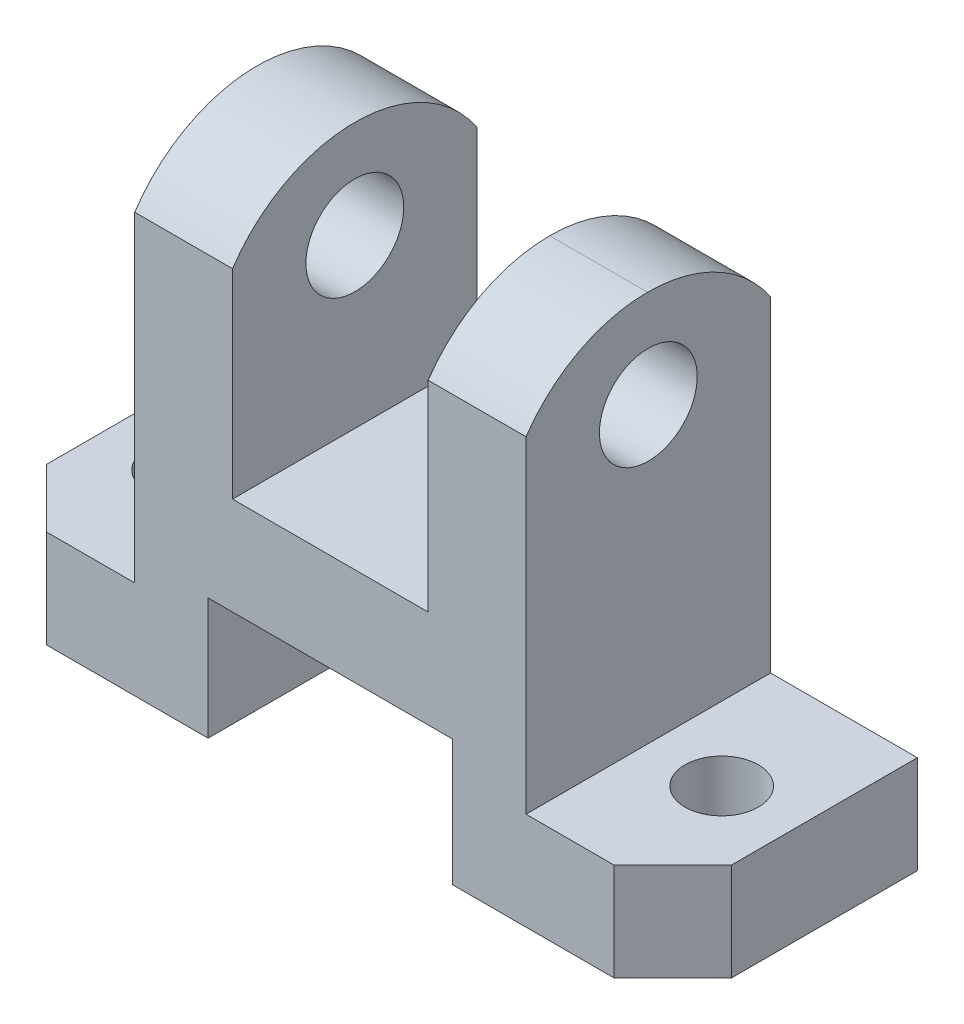
ISO-10303-21;
HEADER;
FILE_DESCRIPTION(('STEP AP214'),'2;1');
FILE_NAME('part.step','',(''),(''),'','','');
FILE_SCHEMA(('AUTOMOTIVE_DESIGN { 1 0 10303 214 1 1 1 1 }'));
ENDSEC;
DATA;
#1=APPLICATION_CONTEXT('core data for automotive mechanical design processes');
#2=APPLICATION_PROTOCOL_DEFINITION('international standard','automotive_design',2000,#1);
#3=PRODUCT_CONTEXT('',#1,'mechanical');
#4=PRODUCT('Part','Part','',(#3));
#5=PRODUCT_RELATED_PRODUCT_CATEGORY('part','',(#4));
#6=PRODUCT_DEFINITION_FORMATION('','',#4);
#7=PRODUCT_DEFINITION_CONTEXT('part definition',#1,'design');
#8=PRODUCT_DEFINITION('design','',#6,#7);
#9=PRODUCT_DEFINITION_SHAPE('','',#8);
#10=(LENGTH_UNIT() NAMED_UNIT(*) SI_UNIT(.MILLI.,.METRE.));
#11=(NAMED_UNIT(*) PLANE_ANGLE_UNIT() SI_UNIT($,.RADIAN.));
#12=(NAMED_UNIT(*) SI_UNIT($,.STERADIAN.) SOLID_ANGLE_UNIT());
#13=UNCERTAINTY_MEASURE_WITH_UNIT(LENGTH_MEASURE(1.E-05),#10,'distance_accuracy_value','');
#14=(GEOMETRIC_REPRESENTATION_CONTEXT(3) GLOBAL_UNCERTAINTY_ASSIGNED_CONTEXT((#13)) GLOBAL_UNIT_ASSIGNED_CONTEXT((#10,
#11,#12)) REPRESENTATION_CONTEXT('',''));
#15=CARTESIAN_POINT('',(0.,0.,0.));
#16=DIRECTION('',(0.,0.,1.));
#17=DIRECTION('',(1.,0.,0.));
#18=AXIS2_PLACEMENT_3D('',#15,#16,#17);
#19=CARTESIAN_POINT('',(-77.6358756958496,41.7128283446307,31.75));
#20=DIRECTION('',(1.,0.,0.));
#21=DIRECTION('',(0.,1.,0.));
#22=AXIS2_PLACEMENT_3D('',#19,#20,#21);
#23=PLANE('',#22);
#24=CARTESIAN_POINT('',(-77.6358756958496,28.4062611804516,15.875));
#25=DIRECTION('',(1.,0.,0.));
#26=DIRECTION('',(0.,1.,0.));
#27=AXIS2_PLACEMENT_3D('',#24,#25,#26);
#28=CIRCLE('',#27,6.35);
#29=CARTESIAN_POINT('',(-77.6358756958496,34.7562611804516,15.875));
#30=VERTEX_POINT('',#29);
#31=EDGE_CURVE('E343',#30,#30,#28,.T.);
#32=ORIENTED_EDGE('',*,*,#31,.T.);
#33=EDGE_LOOP('',(#32));
#34=FACE_BOUND('',#33,.T.);
#35=CARTESIAN_POINT('',(-77.6358756958496,22.0562611804516,15.875));
#36=DIRECTION('',(-1.,0.,0.));
#37=DIRECTION('',(0.,-1.,0.));
#38=AXIS2_PLACEMENT_3D('',#35,#36,#37);
#39=CIRCLE('',#38,19.05);
#40=CARTESIAN_POINT('',(-77.6358756958496,32.58654488983,31.75));
#41=VERTEX_POINT('',#40);
#42=CARTESIAN_POINT('',(-77.6358756958496,32.58654488983,0.));
#43=VERTEX_POINT('',#42);
#44=EDGE_CURVE('E169',#41,#43,#39,.T.);
#45=ORIENTED_EDGE('',*,*,#44,.T.);
#46=DIRECTION('',(0.,-1.,0.));
#47=VECTOR('',#46,1.);
#48=CARTESIAN_POINT('',(-77.6358756958496,41.7128283446307,0.));
#49=LINE('',#48,#47);
#50=CARTESIAN_POINT('',(-77.6358756958496,-9.08717165536931,0.));
#51=VERTEX_POINT('',#50);
#52=EDGE_CURVE('E173',#43,#51,#49,.T.);
#53=ORIENTED_EDGE('',*,*,#52,.T.);
#54=DIRECTION('',(0.,0.,-1.));
#55=VECTOR('',#54,1.);
#56=CARTESIAN_POINT('',(-77.6358756958496,-9.08717165536931,31.75));
#57=LINE('',#56,#55);
#58=CARTESIAN_POINT('',(-77.6358756958496,-9.08717165536931,31.75));
#59=VERTEX_POINT('',#58);
#60=EDGE_CURVE('E289',#59,#51,#57,.T.);
#61=ORIENTED_EDGE('',*,*,#60,.F.);
#62=DIRECTION('',(0.,-1.,0.));
#63=VECTOR('',#62,1.);
#64=CARTESIAN_POINT('',(-77.6358756958496,41.7128283446307,31.75));
#65=LINE('',#64,#63);
#66=EDGE_CURVE('E175',#41,#59,#65,.T.);
#67=ORIENTED_EDGE('',*,*,#66,.F.);
#68=EDGE_LOOP('',(#45,#53,#61,#67));
#69=FACE_BOUND('',#68,.T.);
#70=ADVANCED_FACE('F38',(#34,#69),#23,.F.);
#71=CARTESIAN_POINT('',(-64.9358756958496,41.7128283446307,31.75));
#72=DIRECTION('',(-1.,0.,0.));
#73=DIRECTION('',(0.,0.,1.));
#74=AXIS2_PLACEMENT_3D('',#71,#72,#73);
#75=PLANE('',#74);
#76=CARTESIAN_POINT('',(-64.9358756958496,28.4062611804516,15.875));
#77=DIRECTION('',(-1.,0.,0.));
#78=DIRECTION('',(0.,0.,1.));
#79=AXIS2_PLACEMENT_3D('',#76,#77,#78);
#80=CIRCLE('',#79,6.35);
#81=CARTESIAN_POINT('',(-64.9358756958496,28.4062611804516,22.225));
#82=VERTEX_POINT('',#81);
#83=EDGE_CURVE('E294',#82,#82,#80,.T.);
#84=ORIENTED_EDGE('',*,*,#83,.T.);
#85=EDGE_LOOP('',(#84));
#86=FACE_BOUND('',#85,.T.);
#87=DIRECTION('',(0.,1.,0.));
#88=VECTOR('',#87,1.);
#89=CARTESIAN_POINT('',(-64.9358756958496,41.7128283446307,0.));
#90=LINE('',#89,#88);
#91=CARTESIAN_POINT('',(-64.9358756958496,6.68357461328742,0.));
#92=VERTEX_POINT('',#91);
#93=CARTESIAN_POINT('',(-64.9358756958496,32.58654488983,0.));
#94=VERTEX_POINT('',#93);
#95=EDGE_CURVE('E246',#92,#94,#90,.T.);
#96=ORIENTED_EDGE('',*,*,#95,.T.);
#97=CARTESIAN_POINT('',(-64.9358756958496,22.0562611804516,15.875));
#98=DIRECTION('',(-1.,0.,0.));
#99=DIRECTION('',(0.,0.,1.));
#100=AXIS2_PLACEMENT_3D('',#97,#98,#99);
#101=CIRCLE('',#100,19.05);
#102=CARTESIAN_POINT('',(-64.9358756958496,32.58654488983,31.75));
#103=VERTEX_POINT('',#102);
#104=EDGE_CURVE('E185',#103,#94,#101,.T.);
#105=ORIENTED_EDGE('',*,*,#104,.F.);
#106=DIRECTION('',(0.,1.,0.));
#107=VECTOR('',#106,1.);
#108=CARTESIAN_POINT('',(-64.9358756958496,41.7128283446307,31.75));
#109=LINE('',#108,#107);
#110=CARTESIAN_POINT('',(-64.9358756958496,6.68357461328742,31.75));
#111=VERTEX_POINT('',#110);
#112=EDGE_CURVE('E207',#111,#103,#109,.T.);
#113=ORIENTED_EDGE('',*,*,#112,.F.);
#114=DIRECTION('',(0.,0.,-1.));
#115=VECTOR('',#114,1.);
#116=CARTESIAN_POINT('',(-64.9358756958496,6.68357461328742,31.75));
#117=LINE('',#116,#115);
#118=EDGE_CURVE('E249',#111,#92,#117,.T.);
#119=ORIENTED_EDGE('',*,*,#118,.T.);
#120=EDGE_LOOP('',(#96,#105,#113,#119));
#121=FACE_BOUND('',#120,.T.);
#122=ADVANCED_FACE('F406',(#86,#121),#75,.F.);
#123=CARTESIAN_POINT('',(0.,0.,0.));
#124=DIRECTION('',(0.,0.,-1.));
#125=DIRECTION('',(-1.,0.,0.));
#126=AXIS2_PLACEMENT_3D('',#123,#124,#125);
#127=PLANE('',#126);
#128=ORIENTED_EDGE('',*,*,#52,.F.);
#129=DIRECTION('',(-1.,0.,0.));
#130=VECTOR('',#129,1.);
#131=CARTESIAN_POINT('',(-52.2358756958496,32.58654488983,0.));
#132=LINE('',#131,#130);
#133=EDGE_CURVE('E180',#94,#43,#132,.T.);
#134=ORIENTED_EDGE('',*,*,#133,.F.);
#135=ORIENTED_EDGE('',*,*,#95,.F.);
#136=DIRECTION('',(-1.,0.,0.));
#137=VECTOR('',#136,1.);
#138=CARTESIAN_POINT('',(-64.9358756958496,6.68357461328742,0.));
#139=LINE('',#138,#137);
#140=CARTESIAN_POINT('',(-39.5358756958496,6.68357461328742,0.));
#141=VERTEX_POINT('',#140);
#142=EDGE_CURVE('E243',#141,#92,#139,.T.);
#143=ORIENTED_EDGE('',*,*,#142,.F.);
#144=DIRECTION('',(0.,-1.,0.));
#145=VECTOR('',#144,1.);
#146=CARTESIAN_POINT('',(-39.5358756958496,6.68357461328742,0.));
#147=LINE('',#146,#145);
#148=CARTESIAN_POINT('',(-39.5358756958496,32.58654488983,0.));
#149=VERTEX_POINT('',#148);
#150=EDGE_CURVE('E240',#149,#141,#147,.T.);
#151=ORIENTED_EDGE('',*,*,#150,.F.);
#152=DIRECTION('',(1.,0.,0.));
#153=VECTOR('',#152,1.);
#154=CARTESIAN_POINT('',(-52.2358756958496,32.58654488983,0.));
#155=LINE('',#154,#153);
#156=CARTESIAN_POINT('',(-26.8358756958496,32.58654488983,0.));
#157=VERTEX_POINT('',#156);
#158=EDGE_CURVE('E321',#149,#157,#155,.T.);
#159=ORIENTED_EDGE('',*,*,#158,.T.);
#160=DIRECTION('',(0.,1.,0.));
#161=VECTOR('',#160,1.);
#162=CARTESIAN_POINT('',(-26.8358756958496,41.1062611804516,0.));
#163=LINE('',#162,#161);
#164=CARTESIAN_POINT('',(-26.8358756958496,-9.6937388195484,0.));
#165=VERTEX_POINT('',#164);
#166=EDGE_CURVE('E236',#165,#157,#163,.T.);
#167=ORIENTED_EDGE('',*,*,#166,.F.);
#168=DIRECTION('',(-1.,0.,0.));
#169=VECTOR('',#168,1.);
#170=CARTESIAN_POINT('',(-26.8358756958496,-9.6937388195484,0.));
#171=LINE('',#170,#169);
#172=CARTESIAN_POINT('',(-7.78587569584956,-9.6937388195484,0.));
#173=VERTEX_POINT('',#172);
#174=EDGE_CURVE('E233',#173,#165,#171,.T.);
#175=ORIENTED_EDGE('',*,*,#174,.F.);
#176=DIRECTION('',(0.,1.,0.));
#177=VECTOR('',#176,1.);
#178=CARTESIAN_POINT('',(-7.78587569584956,-9.6937388195484,0.));
#179=LINE('',#178,#177);
#180=CARTESIAN_POINT('',(-7.78587569584956,-22.3937388195484,0.));
#181=VERTEX_POINT('',#180);
#182=EDGE_CURVE('E229',#181,#173,#179,.T.);
#183=ORIENTED_EDGE('',*,*,#182,.F.);
#184=DIRECTION('',(1.,0.,0.));
#185=VECTOR('',#184,1.);
#186=CARTESIAN_POINT('',(-7.78587569584956,-22.3937388195484,0.));
#187=LINE('',#186,#185);
#188=CARTESIAN_POINT('',(-36.3608756958496,-22.3937388195484,0.));
#189=VERTEX_POINT('',#188);
#190=EDGE_CURVE('E225',#189,#181,#187,.T.);
#191=ORIENTED_EDGE('',*,*,#190,.F.);
#192=DIRECTION('',(0.,-1.,0.));
#193=VECTOR('',#192,1.);
#194=CARTESIAN_POINT('',(-36.3608756958496,-22.3937388195484,0.));
#195=LINE('',#194,#193);
#196=CARTESIAN_POINT('',(-36.3608756958496,-6.01642538671258,0.));
#197=VERTEX_POINT('',#196);
#198=EDGE_CURVE('E222',#197,#189,#195,.T.);
#199=ORIENTED_EDGE('',*,*,#198,.F.);
#200=DIRECTION('',(1.,0.,0.));
#201=VECTOR('',#200,1.);
#202=CARTESIAN_POINT('',(-36.3608756958496,-6.01642538671258,0.));
#203=LINE('',#202,#201);
#204=CARTESIAN_POINT('',(-68.1108756958496,-6.01642538671258,0.));
#205=VERTEX_POINT('',#204);
#206=EDGE_CURVE('E219',#205,#197,#203,.T.);
#207=ORIENTED_EDGE('',*,*,#206,.F.);
#208=DIRECTION('',(0.,1.,0.));
#209=VECTOR('',#208,1.);
#210=CARTESIAN_POINT('',(-68.1108756958496,-6.01642538671258,0.));
#211=LINE('',#210,#209);
#212=CARTESIAN_POINT('',(-68.1108756958496,-21.7871716553693,0.));
#213=VERTEX_POINT('',#212);
#214=EDGE_CURVE('E216',#213,#205,#211,.T.);
#215=ORIENTED_EDGE('',*,*,#214,.F.);
#216=DIRECTION('',(1.,0.,0.));
#217=VECTOR('',#216,1.);
#218=CARTESIAN_POINT('',(-68.1108756958496,-21.7871716553693,0.));
#219=LINE('',#218,#217);
#220=CARTESIAN_POINT('',(-96.6858756958496,-21.7871716553693,0.));
#221=VERTEX_POINT('',#220);
#222=EDGE_CURVE('E213',#221,#213,#219,.T.);
#223=ORIENTED_EDGE('',*,*,#222,.F.);
#224=DIRECTION('',(0.,-1.,0.));
#225=VECTOR('',#224,1.);
#226=CARTESIAN_POINT('',(-96.6858756958496,-21.7871716553693,0.));
#227=LINE('',#226,#225);
#228=CARTESIAN_POINT('',(-96.6858756958496,-9.08717165536931,0.));
#229=VERTEX_POINT('',#228);
#230=EDGE_CURVE('E202',#229,#221,#227,.T.);
#231=ORIENTED_EDGE('',*,*,#230,.F.);
#232=DIRECTION('',(-1.,0.,0.));
#233=VECTOR('',#232,1.);
#234=CARTESIAN_POINT('',(-77.6358756958496,-9.08717165536931,0.));
#235=LINE('',#234,#233);
#236=EDGE_CURVE('E195',#51,#229,#235,.T.);
#237=ORIENTED_EDGE('',*,*,#236,.F.);
#238=EDGE_LOOP('',(#128,#134,#135,#143,#151,#159,#167,#175,#183,#191,#199,#207,#215,#223,#231,#237));
#239=FACE_BOUND('',#238,.T.);
#240=ADVANCED_FACE('F192',(#239),#127,.T.);
#241=CARTESIAN_POINT('',(0.,0.,31.75));
#242=DIRECTION('',(0.,0.,-1.));
#243=DIRECTION('',(-1.,0.,0.));
#244=AXIS2_PLACEMENT_3D('',#241,#242,#243);
#245=PLANE('',#244);
#246=DIRECTION('',(-1.,0.,0.));
#247=VECTOR('',#246,1.);
#248=CARTESIAN_POINT('',(-52.2358756958496,32.58654488983,31.75));
#249=LINE('',#248,#247);
#250=EDGE_CURVE('E179',#103,#41,#249,.T.);
#251=ORIENTED_EDGE('',*,*,#250,.T.);
#252=ORIENTED_EDGE('',*,*,#66,.T.);
#253=DIRECTION('',(-1.,0.,0.));
#254=VECTOR('',#253,1.);
#255=CARTESIAN_POINT('',(-77.6358756958496,-9.08717165536931,31.75));
#256=LINE('',#255,#254);
#257=CARTESIAN_POINT('',(-89.0658756958496,-9.08717165536932,31.75));
#258=VERTEX_POINT('',#257);
#259=EDGE_CURVE('E367',#59,#258,#256,.T.);
#260=ORIENTED_EDGE('',*,*,#259,.T.);
#261=DIRECTION('',(0.,1.,0.));
#262=VECTOR('',#261,1.);
#263=CARTESIAN_POINT('',(-89.0658756958496,0.,31.75));
#264=LINE('',#263,#262);
#265=CARTESIAN_POINT('',(-89.0658756958496,-21.7871716553693,31.75));
#266=VERTEX_POINT('',#265);
#267=EDGE_CURVE('E47',#266,#258,#264,.T.);
#268=ORIENTED_EDGE('',*,*,#267,.F.);
#269=DIRECTION('',(1.,0.,0.));
#270=VECTOR('',#269,1.);
#271=CARTESIAN_POINT('',(-68.1108756958496,-21.7871716553693,31.75));
#272=LINE('',#271,#270);
#273=CARTESIAN_POINT('',(-68.1108756958496,-21.7871716553693,31.75));
#274=VERTEX_POINT('',#273);
#275=EDGE_CURVE('E371',#266,#274,#272,.T.);
#276=ORIENTED_EDGE('',*,*,#275,.T.);
#277=DIRECTION('',(0.,1.,0.));
#278=VECTOR('',#277,1.);
#279=CARTESIAN_POINT('',(-68.1108756958496,-6.01642538671258,31.75));
#280=LINE('',#279,#278);
#281=CARTESIAN_POINT('',(-68.1108756958496,-6.01642538671258,31.75));
#282=VERTEX_POINT('',#281);
#283=EDGE_CURVE('E374',#274,#282,#280,.T.);
#284=ORIENTED_EDGE('',*,*,#283,.T.);
#285=DIRECTION('',(1.,0.,0.));
#286=VECTOR('',#285,1.);
#287=CARTESIAN_POINT('',(-36.3608756958496,-6.01642538671258,31.75));
#288=LINE('',#287,#286);
#289=CARTESIAN_POINT('',(-36.3608756958496,-6.01642538671258,31.75));
#290=VERTEX_POINT('',#289);
#291=EDGE_CURVE('E377',#282,#290,#288,.T.);
#292=ORIENTED_EDGE('',*,*,#291,.T.);
#293=DIRECTION('',(0.,-1.,0.));
#294=VECTOR('',#293,1.);
#295=CARTESIAN_POINT('',(-36.3608756958496,-22.3937388195484,31.75));
#296=LINE('',#295,#294);
#297=CARTESIAN_POINT('',(-36.3608756958496,-22.3937388195484,31.75));
#298=VERTEX_POINT('',#297);
#299=EDGE_CURVE('E380',#290,#298,#296,.T.);
#300=ORIENTED_EDGE('',*,*,#299,.T.);
#301=DIRECTION('',(1.,0.,0.));
#302=VECTOR('',#301,1.);
#303=CARTESIAN_POINT('',(-7.78587569584956,-22.3937388195484,31.75));
#304=LINE('',#303,#302);
#305=CARTESIAN_POINT('',(-15.4058756958496,-22.3937388195484,31.75));
#306=VERTEX_POINT('',#305);
#307=EDGE_CURVE('E383',#298,#306,#304,.T.);
#308=ORIENTED_EDGE('',*,*,#307,.T.);
#309=DIRECTION('',(0.,1.,0.));
#310=VECTOR('',#309,1.);
#311=CARTESIAN_POINT('',(-15.4058756958496,-22.3937388195484,31.75));
#312=LINE('',#311,#310);
#313=CARTESIAN_POINT('',(-15.4058756958496,-9.6937388195484,31.75));
#314=VERTEX_POINT('',#313);
#315=EDGE_CURVE('E352',#306,#314,#312,.T.);
#316=ORIENTED_EDGE('',*,*,#315,.T.);
#317=DIRECTION('',(-1.,0.,0.));
#318=VECTOR('',#317,1.);
#319=CARTESIAN_POINT('',(-26.8358756958496,-9.6937388195484,31.75));
#320=LINE('',#319,#318);
#321=CARTESIAN_POINT('',(-26.8358756958496,-9.6937388195484,31.75));
#322=VERTEX_POINT('',#321);
#323=EDGE_CURVE('E387',#314,#322,#320,.T.);
#324=ORIENTED_EDGE('',*,*,#323,.T.);
#325=DIRECTION('',(0.,1.,0.));
#326=VECTOR('',#325,1.);
#327=CARTESIAN_POINT('',(-26.8358756958496,41.1062611804516,31.75));
#328=LINE('',#327,#326);
#329=CARTESIAN_POINT('',(-26.8358756958496,32.7439433830127,31.75));
#330=VERTEX_POINT('',#329);
#331=EDGE_CURVE('E390',#322,#330,#328,.T.);
#332=ORIENTED_EDGE('',*,*,#331,.T.);
#333=DIRECTION('',(1.,0.,0.));
#334=VECTOR('',#333,1.);
#335=CARTESIAN_POINT('',(-58.5858756958496,32.7439433830127,31.75));
#336=LINE('',#335,#334);
#337=CARTESIAN_POINT('',(-39.5358756958496,32.7439433830127,31.75));
#338=VERTEX_POINT('',#337);
#339=EDGE_CURVE('E332',#338,#330,#336,.T.);
#340=ORIENTED_EDGE('',*,*,#339,.F.);
#341=DIRECTION('',(0.,-1.,0.));
#342=VECTOR('',#341,1.);
#343=CARTESIAN_POINT('',(-39.5358756958496,6.68357461328742,31.75));
#344=LINE('',#343,#342);
#345=CARTESIAN_POINT('',(-39.5358756958496,6.68357461328742,31.75));
#346=VERTEX_POINT('',#345);
#347=EDGE_CURVE('E394',#338,#346,#344,.T.);
#348=ORIENTED_EDGE('',*,*,#347,.T.);
#349=DIRECTION('',(-1.,0.,0.));
#350=VECTOR('',#349,1.);
#351=CARTESIAN_POINT('',(-64.9358756958496,6.68357461328742,31.75));
#352=LINE('',#351,#350);
#353=EDGE_CURVE('E396',#346,#111,#352,.T.);
#354=ORIENTED_EDGE('',*,*,#353,.T.);
#355=ORIENTED_EDGE('',*,*,#112,.T.);
#356=EDGE_LOOP('',(#251,#252,#260,#268,#276,#284,#292,#300,#308,#316,#324,#332,#340,#348,#354,#355));
#357=FACE_BOUND('',#356,.T.);
#358=ADVANCED_FACE('F404',(#357),#245,.F.);
#359=CARTESIAN_POINT('',(-26.8358756958496,41.1062611804516,31.75));
#360=DIRECTION('',(-1.,0.,0.));
#361=DIRECTION('',(0.,-1.,0.));
#362=AXIS2_PLACEMENT_3D('',#359,#360,#361);
#363=PLANE('',#362);
#364=CARTESIAN_POINT('',(-26.8358756958496,28.4062611804516,15.875));
#365=DIRECTION('',(1.,0.,0.));
#366=DIRECTION('',(0.,1.,0.));
#367=AXIS2_PLACEMENT_3D('',#364,#365,#366);
#368=CIRCLE('',#367,6.35);
#369=CARTESIAN_POINT('',(-26.8358756958496,34.7562611804516,15.875));
#370=VERTEX_POINT('',#369);
#371=EDGE_CURVE('E298',#370,#370,#368,.T.);
#372=ORIENTED_EDGE('',*,*,#371,.F.);
#373=EDGE_LOOP('',(#372));
#374=FACE_BOUND('',#373,.T.);
#375=ORIENTED_EDGE('',*,*,#166,.T.);
#376=CARTESIAN_POINT('',(-26.8358756958496,21.8589569478528,15.9805374493276));
#377=DIRECTION('',(-1.,0.,0.));
#378=DIRECTION('',(0.,-1.,0.));
#379=AXIS2_PLACEMENT_3D('',#376,#377,#378);
#380=CIRCLE('',#379,19.2473042325988);
#381=CARTESIAN_POINT('',(-26.8358756958496,41.1062611804516,15.9805374493276));
#382=VERTEX_POINT('',#381);
#383=EDGE_CURVE('E318',#382,#157,#380,.T.);
#384=ORIENTED_EDGE('',*,*,#383,.F.);
#385=CARTESIAN_POINT('',(-26.8358756958496,22.0562611804516,15.9805374493276));
#386=DIRECTION('',(1.,0.,0.));
#387=DIRECTION('',(0.,1.,0.));
#388=AXIS2_PLACEMENT_3D('',#385,#386,#387);
#389=CIRCLE('',#388,19.05);
#390=EDGE_CURVE('E327',#382,#330,#389,.T.);
#391=ORIENTED_EDGE('',*,*,#390,.T.);
#392=ORIENTED_EDGE('',*,*,#331,.F.);
#393=DIRECTION('',(0.,0.,-1.));
#394=VECTOR('',#393,1.);
#395=CARTESIAN_POINT('',(-26.8358756958496,-9.6937388195484,31.75));
#396=LINE('',#395,#394);
#397=EDGE_CURVE('E257',#322,#165,#396,.T.);
#398=ORIENTED_EDGE('',*,*,#397,.T.);
#399=EDGE_LOOP('',(#375,#384,#391,#392,#398));
#400=FACE_BOUND('',#399,.T.);
#401=ADVANCED_FACE('F424',(#374,#400),#363,.F.);
#402=CARTESIAN_POINT('',(-39.5358756958496,6.68357461328742,31.75));
#403=DIRECTION('',(1.,0.,0.));
#404=DIRECTION('',(0.,0.,-1.));
#405=AXIS2_PLACEMENT_3D('',#402,#403,#404);
#406=PLANE('',#405);
#407=CARTESIAN_POINT('',(-39.5358756958496,28.4062611804516,15.875));
#408=DIRECTION('',(1.,0.,0.));
#409=DIRECTION('',(0.,0.,-1.));
#410=AXIS2_PLACEMENT_3D('',#407,#408,#409);
#411=CIRCLE('',#410,6.35);
#412=CARTESIAN_POINT('',(-39.5358756958496,28.4062611804516,9.525));
#413=VERTEX_POINT('',#412);
#414=EDGE_CURVE('E297',#413,#413,#411,.T.);
#415=ORIENTED_EDGE('',*,*,#414,.T.);
#416=EDGE_LOOP('',(#415));
#417=FACE_BOUND('',#416,.T.);
#418=CARTESIAN_POINT('',(-39.5358756958496,22.0562611804516,15.9805374493276));
#419=DIRECTION('',(1.,0.,0.));
#420=DIRECTION('',(0.,0.,-1.));
#421=AXIS2_PLACEMENT_3D('',#418,#419,#420);
#422=CIRCLE('',#421,19.05);
#423=CARTESIAN_POINT('',(-39.5358756958496,41.1062611804516,15.9805374493276));
#424=VERTEX_POINT('',#423);
#425=EDGE_CURVE('E11',#424,#338,#422,.T.);
#426=ORIENTED_EDGE('',*,*,#425,.F.);
#427=CARTESIAN_POINT('',(-39.5358756958496,21.8589569478528,15.9805374493276));
#428=DIRECTION('',(1.,0.,0.));
#429=DIRECTION('',(0.,0.,-1.));
#430=AXIS2_PLACEMENT_3D('',#427,#428,#429);
#431=CIRCLE('',#430,19.2473042325988);
#432=EDGE_CURVE('E55',#424,#149,#431,.F.);
#433=ORIENTED_EDGE('',*,*,#432,.T.);
#434=ORIENTED_EDGE('',*,*,#150,.T.);
#435=DIRECTION('',(0.,0.,-1.));
#436=VECTOR('',#435,1.);
#437=CARTESIAN_POINT('',(-39.5358756958496,6.68357461328742,31.75));
#438=LINE('',#437,#436);
#439=EDGE_CURVE('E253',#346,#141,#438,.T.);
#440=ORIENTED_EDGE('',*,*,#439,.F.);
#441=ORIENTED_EDGE('',*,*,#347,.F.);
#442=EDGE_LOOP('',(#426,#433,#434,#440,#441));
#443=FACE_BOUND('',#442,.T.);
#444=ADVANCED_FACE('F415',(#417,#443),#406,.F.);
#445=CARTESIAN_POINT('',(-77.6358756958496,-9.08717165536931,31.75));
#446=DIRECTION('',(0.,-1.,0.));
#447=DIRECTION('',(1.,0.,0.));
#448=AXIS2_PLACEMENT_3D('',#445,#446,#447);
#449=PLANE('',#448);
#450=CARTESIAN_POINT('',(-87.1608756958496,-9.08717165536931,15.875));
#451=DIRECTION('',(0.,1.,0.));
#452=DIRECTION('',(-1.,0.,0.));
#453=AXIS2_PLACEMENT_3D('',#450,#451,#452);
#454=CIRCLE('',#453,4.7625);
#455=CARTESIAN_POINT('',(-91.9233756958496,-9.08717165536931,15.875));
#456=VERTEX_POINT('',#455);
#457=EDGE_CURVE('E311',#456,#456,#454,.T.);
#458=ORIENTED_EDGE('',*,*,#457,.F.);
#459=EDGE_LOOP('',(#458));
#460=FACE_BOUND('',#459,.T.);
#461=DIRECTION('',(-0.707106781186548,0.,-0.707106781186547));
#462=VECTOR('',#461,1.);
#463=CARTESIAN_POINT('',(-83.3508756958496,-9.08717165536931,37.465));
#464=LINE('',#463,#462);
#465=CARTESIAN_POINT('',(-96.6858756958496,-9.08717165536932,24.13));
#466=VERTEX_POINT('',#465);
#467=EDGE_CURVE('E198',#258,#466,#464,.T.);
#468=ORIENTED_EDGE('',*,*,#467,.F.);
#469=ORIENTED_EDGE('',*,*,#259,.F.);
#470=ORIENTED_EDGE('',*,*,#60,.T.);
#471=ORIENTED_EDGE('',*,*,#236,.T.);
#472=DIRECTION('',(0.,0.,-1.));
#473=VECTOR('',#472,1.);
#474=CARTESIAN_POINT('',(-96.6858756958496,-9.08717165536931,31.75));
#475=LINE('',#474,#473);
#476=EDGE_CURVE('E286',#466,#229,#475,.T.);
#477=ORIENTED_EDGE('',*,*,#476,.F.);
#478=EDGE_LOOP('',(#468,#469,#470,#471,#477));
#479=FACE_BOUND('',#478,.T.);
#480=ADVANCED_FACE('F468',(#460,#479),#449,.F.);
#481=CARTESIAN_POINT('',(-96.6858756958496,-21.7871716553693,31.75));
#482=DIRECTION('',(1.,0.,0.));
#483=DIRECTION('',(0.,0.,-1.));
#484=AXIS2_PLACEMENT_3D('',#481,#482,#483);
#485=PLANE('',#484);
#486=DIRECTION('',(0.,1.,0.));
#487=VECTOR('',#486,1.);
#488=CARTESIAN_POINT('',(-96.6858756958496,-22.3937388195484,24.13));
#489=LINE('',#488,#487);
#490=CARTESIAN_POINT('',(-96.6858756958496,-21.7871716553693,24.13));
#491=VERTEX_POINT('',#490);
#492=EDGE_CURVE('E348',#491,#466,#489,.T.);
#493=ORIENTED_EDGE('',*,*,#492,.T.);
#494=ORIENTED_EDGE('',*,*,#476,.T.);
#495=ORIENTED_EDGE('',*,*,#230,.T.);
#496=DIRECTION('',(0.,0.,-1.));
#497=VECTOR('',#496,1.);
#498=CARTESIAN_POINT('',(-96.6858756958496,-21.7871716553693,31.75));
#499=LINE('',#498,#497);
#500=EDGE_CURVE('E283',#491,#221,#499,.T.);
#501=ORIENTED_EDGE('',*,*,#500,.F.);
#502=EDGE_LOOP('',(#493,#494,#495,#501));
#503=FACE_BOUND('',#502,.T.);
#504=ADVANCED_FACE('F464',(#503),#485,.F.);
#505=CARTESIAN_POINT('',(-68.1108756958496,-21.7871716553693,31.75));
#506=DIRECTION('',(0.,1.,0.));
#507=DIRECTION('',(0.,0.,1.));
#508=AXIS2_PLACEMENT_3D('',#505,#506,#507);
#509=PLANE('',#508);
#510=CARTESIAN_POINT('',(-87.1608756958496,-21.7871716553693,15.875));
#511=DIRECTION('',(0.,1.,0.));
#512=DIRECTION('',(0.,0.,1.));
#513=AXIS2_PLACEMENT_3D('',#510,#511,#512);
#514=CIRCLE('',#513,4.7625);
#515=CARTESIAN_POINT('',(-87.1608756958496,-21.7871716553693,20.6375));
#516=VERTEX_POINT('',#515);
#517=EDGE_CURVE('E41',#516,#516,#514,.T.);
#518=ORIENTED_EDGE('',*,*,#517,.T.);
#519=EDGE_LOOP('',(#518));
#520=FACE_BOUND('',#519,.T.);
#521=DIRECTION('',(0.707106781186548,0.,0.707106781186547));
#522=VECTOR('',#521,1.);
#523=CARTESIAN_POINT('',(-78.5883756958496,-21.7871716553693,42.2275));
#524=LINE('',#523,#522);
#525=EDGE_CURVE('E204',#491,#266,#524,.T.);
#526=ORIENTED_EDGE('',*,*,#525,.F.);
#527=ORIENTED_EDGE('',*,*,#500,.T.);
#528=ORIENTED_EDGE('',*,*,#222,.T.);
#529=DIRECTION('',(0.,0.,-1.));
#530=VECTOR('',#529,1.);
#531=CARTESIAN_POINT('',(-68.1108756958496,-21.7871716553693,31.75));
#532=LINE('',#531,#530);
#533=EDGE_CURVE('E279',#274,#213,#532,.T.);
#534=ORIENTED_EDGE('',*,*,#533,.F.);
#535=ORIENTED_EDGE('',*,*,#275,.F.);
#536=EDGE_LOOP('',(#526,#527,#528,#534,#535));
#537=FACE_BOUND('',#536,.T.);
#538=ADVANCED_FACE('F460',(#520,#537),#509,.F.);
#539=CARTESIAN_POINT('',(-68.1108756958496,-6.01642538671258,31.75));
#540=DIRECTION('',(-1.,0.,0.));
#541=DIRECTION('',(0.,0.,1.));
#542=AXIS2_PLACEMENT_3D('',#539,#540,#541);
#543=PLANE('',#542);
#544=ORIENTED_EDGE('',*,*,#214,.T.);
#545=DIRECTION('',(0.,0.,-1.));
#546=VECTOR('',#545,1.);
#547=CARTESIAN_POINT('',(-68.1108756958496,-6.01642538671258,31.75));
#548=LINE('',#547,#546);
#549=EDGE_CURVE('E275',#282,#205,#548,.T.);
#550=ORIENTED_EDGE('',*,*,#549,.F.);
#551=ORIENTED_EDGE('',*,*,#283,.F.);
#552=ORIENTED_EDGE('',*,*,#533,.T.);
#553=EDGE_LOOP('',(#544,#550,#551,#552));
#554=FACE_BOUND('',#553,.T.);
#555=ADVANCED_FACE('F455',(#554),#543,.F.);
#556=CARTESIAN_POINT('',(-36.3608756958496,-6.01642538671258,31.75));
#557=DIRECTION('',(0.,1.,0.));
#558=DIRECTION('',(-1.,0.,0.));
#559=AXIS2_PLACEMENT_3D('',#556,#557,#558);
#560=PLANE('',#559);
#561=ORIENTED_EDGE('',*,*,#206,.T.);
#562=DIRECTION('',(0.,0.,-1.));
#563=VECTOR('',#562,1.);
#564=CARTESIAN_POINT('',(-36.3608756958496,-6.01642538671258,31.75));
#565=LINE('',#564,#563);
#566=EDGE_CURVE('E271',#290,#197,#565,.T.);
#567=ORIENTED_EDGE('',*,*,#566,.F.);
#568=ORIENTED_EDGE('',*,*,#291,.F.);
#569=ORIENTED_EDGE('',*,*,#549,.T.);
#570=EDGE_LOOP('',(#561,#567,#568,#569));
#571=FACE_BOUND('',#570,.T.);
#572=ADVANCED_FACE('F451',(#571),#560,.F.);
#573=CARTESIAN_POINT('',(-36.3608756958496,-22.3937388195484,31.75));
#574=DIRECTION('',(1.,0.,0.));
#575=DIRECTION('',(0.,0.,-1.));
#576=AXIS2_PLACEMENT_3D('',#573,#574,#575);
#577=PLANE('',#576);
#578=ORIENTED_EDGE('',*,*,#198,.T.);
#579=DIRECTION('',(0.,0.,-1.));
#580=VECTOR('',#579,1.);
#581=CARTESIAN_POINT('',(-36.3608756958496,-22.3937388195484,31.75));
#582=LINE('',#581,#580);
#583=EDGE_CURVE('E267',#298,#189,#582,.T.);
#584=ORIENTED_EDGE('',*,*,#583,.F.);
#585=ORIENTED_EDGE('',*,*,#299,.F.);
#586=ORIENTED_EDGE('',*,*,#566,.T.);
#587=EDGE_LOOP('',(#578,#584,#585,#586));
#588=FACE_BOUND('',#587,.T.);
#589=ADVANCED_FACE('F446',(#588),#577,.F.);
#590=CARTESIAN_POINT('',(-7.78587569584956,-22.3937388195484,31.75));
#591=DIRECTION('',(0.,1.,0.));
#592=DIRECTION('',(-1.,0.,0.));
#593=AXIS2_PLACEMENT_3D('',#590,#591,#592);
#594=PLANE('',#593);
#595=CARTESIAN_POINT('',(-17.3108756958496,-22.3937388195484,15.875));
#596=DIRECTION('',(0.,1.,0.));
#597=DIRECTION('',(-1.,0.,0.));
#598=AXIS2_PLACEMENT_3D('',#595,#596,#597);
#599=CIRCLE('',#598,4.7625);
#600=CARTESIAN_POINT('',(-22.0733756958496,-22.3937388195484,15.875));
#601=VERTEX_POINT('',#600);
#602=EDGE_CURVE('E301',#601,#601,#599,.T.);
#603=ORIENTED_EDGE('',*,*,#602,.T.);
#604=EDGE_LOOP('',(#603));
#605=FACE_BOUND('',#604,.T.);
#606=DIRECTION('',(0.,0.,-1.));
#607=VECTOR('',#606,1.);
#608=CARTESIAN_POINT('',(-7.78587569584956,-22.3937388195484,31.75));
#609=LINE('',#608,#607);
#610=CARTESIAN_POINT('',(-7.78587569584956,-22.3937388195484,24.13));
#611=VERTEX_POINT('',#610);
#612=EDGE_CURVE('E264',#611,#181,#609,.T.);
#613=ORIENTED_EDGE('',*,*,#612,.F.);
#614=DIRECTION('',(-0.707106781186548,0.,0.707106781186547));
#615=VECTOR('',#614,1.);
#616=CARTESIAN_POINT('',(8.17206215207522,-22.3937388195484,8.17206215207522));
#617=LINE('',#616,#615);
#618=EDGE_CURVE('E347',#611,#306,#617,.T.);
#619=ORIENTED_EDGE('',*,*,#618,.T.);
#620=ORIENTED_EDGE('',*,*,#307,.F.);
#621=ORIENTED_EDGE('',*,*,#583,.T.);
#622=ORIENTED_EDGE('',*,*,#190,.T.);
#623=EDGE_LOOP('',(#613,#619,#620,#621,#622));
#624=FACE_BOUND('',#623,.T.);
#625=ADVANCED_FACE('F439',(#605,#624),#594,.F.);
#626=CARTESIAN_POINT('',(-7.78587569584956,-9.6937388195484,31.75));
#627=DIRECTION('',(-1.,0.,0.));
#628=DIRECTION('',(0.,-1.,0.));
#629=AXIS2_PLACEMENT_3D('',#626,#627,#628);
#630=PLANE('',#629);
#631=DIRECTION('',(0.,0.,-1.));
#632=VECTOR('',#631,1.);
#633=CARTESIAN_POINT('',(-7.78587569584956,-9.6937388195484,31.75));
#634=LINE('',#633,#632);
#635=CARTESIAN_POINT('',(-7.78587569584956,-9.69373881954841,24.13));
#636=VERTEX_POINT('',#635);
#637=EDGE_CURVE('E261',#636,#173,#634,.T.);
#638=ORIENTED_EDGE('',*,*,#637,.F.);
#639=DIRECTION('',(0.,1.,0.));
#640=VECTOR('',#639,1.);
#641=CARTESIAN_POINT('',(-7.78587569584956,-22.3937388195484,24.13));
#642=LINE('',#641,#640);
#643=EDGE_CURVE('E356',#611,#636,#642,.T.);
#644=ORIENTED_EDGE('',*,*,#643,.F.);
#645=ORIENTED_EDGE('',*,*,#612,.T.);
#646=ORIENTED_EDGE('',*,*,#182,.T.);
#647=EDGE_LOOP('',(#638,#644,#645,#646));
#648=FACE_BOUND('',#647,.T.);
#649=ADVANCED_FACE('F436',(#648),#630,.F.);
#650=CARTESIAN_POINT('',(-26.8358756958496,-9.6937388195484,31.75));
#651=DIRECTION('',(0.,-1.,0.));
#652=DIRECTION('',(1.,0.,0.));
#653=AXIS2_PLACEMENT_3D('',#650,#651,#652);
#654=PLANE('',#653);
#655=CARTESIAN_POINT('',(-17.3108756958496,-9.6937388195484,15.875));
#656=DIRECTION('',(0.,-1.,0.));
#657=DIRECTION('',(1.,0.,0.));
#658=AXIS2_PLACEMENT_3D('',#655,#656,#657);
#659=CIRCLE('',#658,4.7625);
#660=CARTESIAN_POINT('',(-12.5483756958496,-9.6937388195484,15.875));
#661=VERTEX_POINT('',#660);
#662=EDGE_CURVE('E190',#661,#661,#659,.T.);
#663=ORIENTED_EDGE('',*,*,#662,.T.);
#664=EDGE_LOOP('',(#663));
#665=FACE_BOUND('',#664,.T.);
#666=ORIENTED_EDGE('',*,*,#323,.F.);
#667=DIRECTION('',(0.707106781186548,0.,-0.707106781186547));
#668=VECTOR('',#667,1.);
#669=CARTESIAN_POINT('',(-21.1208756958496,-9.6937388195484,37.465));
#670=LINE('',#669,#668);
#671=EDGE_CURVE('E63',#314,#636,#670,.T.);
#672=ORIENTED_EDGE('',*,*,#671,.T.);
#673=ORIENTED_EDGE('',*,*,#637,.T.);
#674=ORIENTED_EDGE('',*,*,#174,.T.);
#675=ORIENTED_EDGE('',*,*,#397,.F.);
#676=EDGE_LOOP('',(#666,#672,#673,#674,#675));
#677=FACE_BOUND('',#676,.T.);
#678=ADVANCED_FACE('F432',(#665,#677),#654,.F.);
#679=CARTESIAN_POINT('',(-64.9358756958496,6.68357461328742,31.75));
#680=DIRECTION('',(0.,-1.,0.));
#681=DIRECTION('',(1.,0.,0.));
#682=AXIS2_PLACEMENT_3D('',#679,#680,#681);
#683=PLANE('',#682);
#684=ORIENTED_EDGE('',*,*,#142,.T.);
#685=ORIENTED_EDGE('',*,*,#118,.F.);
#686=ORIENTED_EDGE('',*,*,#353,.F.);
#687=ORIENTED_EDGE('',*,*,#439,.T.);
#688=EDGE_LOOP('',(#684,#685,#686,#687));
#689=FACE_BOUND('',#688,.T.);
#690=ADVANCED_FACE('F410',(#689),#683,.F.);
#691=CARTESIAN_POINT('',(8.17206215207522,-22.3937388195484,8.17206215207522));
#692=DIRECTION('',(-0.707106781186547,0.,-0.707106781186548));
#693=DIRECTION('',(-0.707106781186548,0.,0.707106781186547));
#694=AXIS2_PLACEMENT_3D('',#691,#692,#693);
#695=PLANE('',#694);
#696=ORIENTED_EDGE('',*,*,#315,.F.);
#697=ORIENTED_EDGE('',*,*,#618,.F.);
#698=ORIENTED_EDGE('',*,*,#643,.T.);
#699=ORIENTED_EDGE('',*,*,#671,.F.);
#700=EDGE_LOOP('',(#696,#697,#698,#699));
#701=FACE_BOUND('',#700,.T.);
#702=ADVANCED_FACE('F475',(#701),#695,.F.);
#703=CARTESIAN_POINT('',(-60.4079378479248,-22.3937388195484,60.4079378479248));
#704=DIRECTION('',(-0.707106781186547,0.,0.707106781186548));
#705=DIRECTION('',(0.707106781186548,0.,0.707106781186547));
#706=AXIS2_PLACEMENT_3D('',#703,#704,#705);
#707=PLANE('',#706);
#708=ORIENTED_EDGE('',*,*,#467,.T.);
#709=ORIENTED_EDGE('',*,*,#492,.F.);
#710=ORIENTED_EDGE('',*,*,#525,.T.);
#711=ORIENTED_EDGE('',*,*,#267,.T.);
#712=EDGE_LOOP('',(#708,#709,#710,#711));
#713=FACE_BOUND('',#712,.T.);
#714=ADVANCED_FACE('F472',(#713),#707,.T.);
#715=CARTESIAN_POINT('',(-96.6858756958496,28.4062611804516,15.875));
#716=DIRECTION('',(1.,0.,0.));
#717=DIRECTION('',(0.,1.,0.));
#718=AXIS2_PLACEMENT_3D('',#715,#716,#717);
#719=CYLINDRICAL_SURFACE('',#718,6.35);
#720=ORIENTED_EDGE('',*,*,#83,.F.);
#721=EDGE_LOOP('',(#720));
#722=FACE_BOUND('',#721,.T.);
#723=ORIENTED_EDGE('',*,*,#31,.F.);
#724=EDGE_LOOP('',(#723));
#725=FACE_BOUND('',#724,.T.);
#726=ADVANCED_FACE('F474',(#722,#725),#719,.F.);
#727=ORIENTED_EDGE('',*,*,#371,.T.);
#728=EDGE_LOOP('',(#727));
#729=FACE_BOUND('',#728,.T.);
#730=ORIENTED_EDGE('',*,*,#414,.F.);
#731=EDGE_LOOP('',(#730));
#732=FACE_BOUND('',#731,.T.);
#733=ADVANCED_FACE('F481',(#729,#732),#719,.F.);
#734=CARTESIAN_POINT('',(-58.5858756958496,22.0562611804516,15.9805374493276));
#735=DIRECTION('',(1.,0.,0.));
#736=DIRECTION('',(0.,1.,0.));
#737=AXIS2_PLACEMENT_3D('',#734,#735,#736);
#738=CYLINDRICAL_SURFACE('',#737,19.05);
#739=ORIENTED_EDGE('',*,*,#425,.T.);
#740=ORIENTED_EDGE('',*,*,#339,.T.);
#741=ORIENTED_EDGE('',*,*,#390,.F.);
#742=DIRECTION('',(1.,0.,0.));
#743=VECTOR('',#742,1.);
#744=CARTESIAN_POINT('',(-58.5858756958496,41.1062611804516,15.9805374493276));
#745=LINE('',#744,#743);
#746=EDGE_CURVE('E331',#424,#382,#745,.T.);
#747=ORIENTED_EDGE('',*,*,#746,.F.);
#748=EDGE_LOOP('',(#739,#740,#741,#747));
#749=FACE_BOUND('',#748,.T.);
#750=ADVANCED_FACE('F418',(#749),#738,.T.);
#751=CARTESIAN_POINT('',(-52.2358756958496,21.8589569478528,15.9805374493276));
#752=DIRECTION('',(1.,0.,0.));
#753=DIRECTION('',(0.,1.,0.));
#754=AXIS2_PLACEMENT_3D('',#751,#752,#753);
#755=CYLINDRICAL_SURFACE('',#754,19.2473042325988);
#756=ORIENTED_EDGE('',*,*,#746,.T.);
#757=ORIENTED_EDGE('',*,*,#383,.T.);
#758=ORIENTED_EDGE('',*,*,#158,.F.);
#759=ORIENTED_EDGE('',*,*,#432,.F.);
#760=EDGE_LOOP('',(#756,#757,#758,#759));
#761=FACE_BOUND('',#760,.T.);
#762=ADVANCED_FACE('F427',(#761),#755,.T.);
#763=CARTESIAN_POINT('',(-52.2358756958496,22.0562611804516,15.875));
#764=DIRECTION('',(-1.,0.,0.));
#765=DIRECTION('',(0.,-1.,0.));
#766=AXIS2_PLACEMENT_3D('',#763,#764,#765);
#767=CYLINDRICAL_SURFACE('',#766,19.05);
#768=ORIENTED_EDGE('',*,*,#104,.T.);
#769=ORIENTED_EDGE('',*,*,#133,.T.);
#770=ORIENTED_EDGE('',*,*,#44,.F.);
#771=ORIENTED_EDGE('',*,*,#250,.F.);
#772=EDGE_LOOP('',(#768,#769,#770,#771));
#773=FACE_BOUND('',#772,.T.);
#774=ADVANCED_FACE('F183',(#773),#767,.T.);
#775=CARTESIAN_POINT('',(-17.3108756958496,-22.3937388195484,15.875));
#776=DIRECTION('',(0.,1.,0.));
#777=DIRECTION('',(-1.,0.,0.));
#778=AXIS2_PLACEMENT_3D('',#775,#776,#777);
#779=CYLINDRICAL_SURFACE('',#778,4.7625);
#780=ORIENTED_EDGE('',*,*,#602,.F.);
#781=EDGE_LOOP('',(#780));
#782=FACE_BOUND('',#781,.T.);
#783=ORIENTED_EDGE('',*,*,#662,.F.);
#784=EDGE_LOOP('',(#783));
#785=FACE_BOUND('',#784,.T.);
#786=ADVANCED_FACE('F537',(#782,#785),#779,.F.);
#787=CARTESIAN_POINT('',(-87.1608756958496,-22.3937388195484,15.875));
#788=DIRECTION('',(0.,1.,0.));
#789=DIRECTION('',(-1.,0.,0.));
#790=AXIS2_PLACEMENT_3D('',#787,#788,#789);
#791=CYLINDRICAL_SURFACE('',#790,4.7625);
#792=ORIENTED_EDGE('',*,*,#457,.T.);
#793=EDGE_LOOP('',(#792));
#794=FACE_BOUND('',#793,.T.);
#795=ORIENTED_EDGE('',*,*,#517,.F.);
#796=EDGE_LOOP('',(#795));
#797=FACE_BOUND('',#796,.T.);
#798=ADVANCED_FACE('F534',(#794,#797),#791,.F.);
#799=CLOSED_SHELL('',(#70,#122,#240,#358,#401,#444,#480,#504,#538,#555,#572,#589,#625,#649,#678,
#690,#702,#714,#726,#733,#750,#762,#774,#786,#798));
#800=MANIFOLD_SOLID_BREP('B2',#799);
#801=ADVANCED_BREP_SHAPE_REPRESENTATION('',(#18,#800),#14);
#802=SHAPE_DEFINITION_REPRESENTATION(#9,#801);
ENDSEC;
END-ISO-10303-21;
